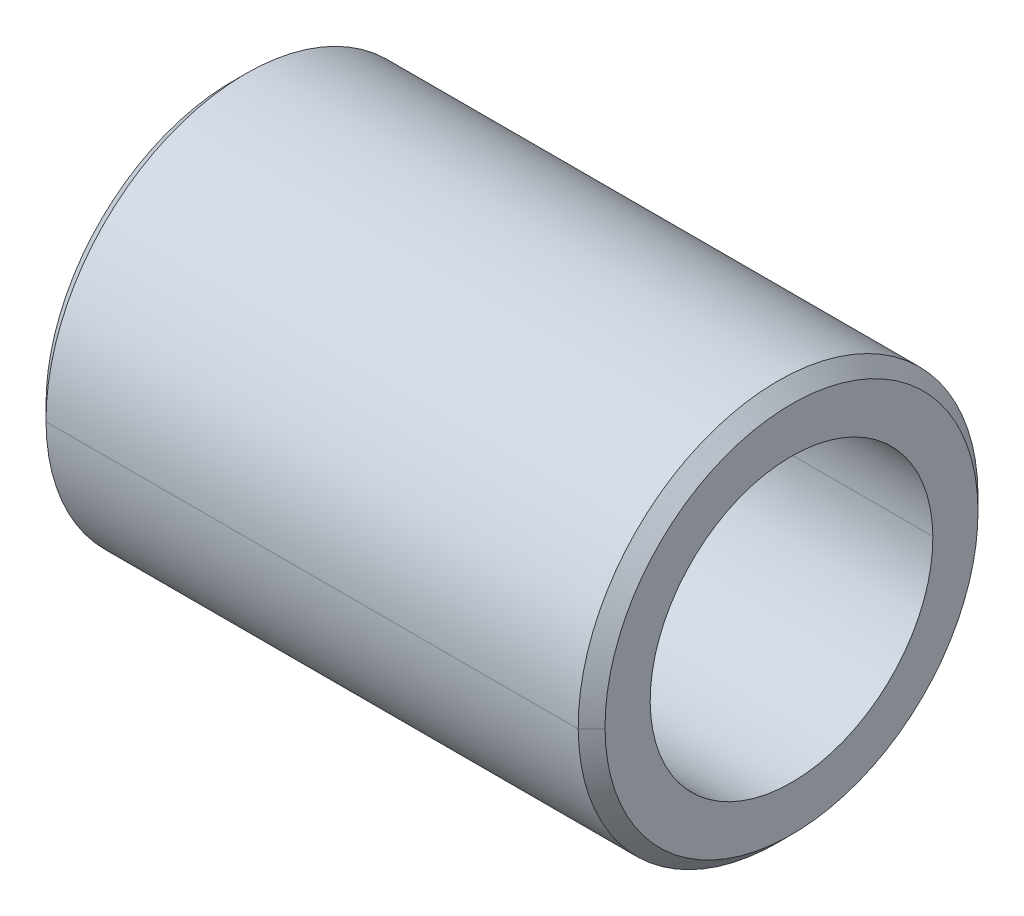
ISO-10303-21;
HEADER;
FILE_DESCRIPTION(('STEP AP214'),'2;1');
FILE_NAME('part.step','',(''),(''),'','','');
FILE_SCHEMA(('AUTOMOTIVE_DESIGN { 1 0 10303 214 1 1 1 1 }'));
ENDSEC;
DATA;
#1=APPLICATION_CONTEXT('core data for automotive mechanical design processes');
#2=APPLICATION_PROTOCOL_DEFINITION('international standard','automotive_design',2000,#1);
#3=PRODUCT_CONTEXT('',#1,'mechanical');
#4=PRODUCT('Part','Part','',(#3));
#5=PRODUCT_RELATED_PRODUCT_CATEGORY('part','',(#4));
#6=PRODUCT_DEFINITION_FORMATION('','',#4);
#7=PRODUCT_DEFINITION_CONTEXT('part definition',#1,'design');
#8=PRODUCT_DEFINITION('design','',#6,#7);
#9=PRODUCT_DEFINITION_SHAPE('','',#8);
#10=(LENGTH_UNIT() NAMED_UNIT(*) SI_UNIT(.MILLI.,.METRE.));
#11=(NAMED_UNIT(*) PLANE_ANGLE_UNIT() SI_UNIT($,.RADIAN.));
#12=(NAMED_UNIT(*) SI_UNIT($,.STERADIAN.) SOLID_ANGLE_UNIT());
#13=UNCERTAINTY_MEASURE_WITH_UNIT(LENGTH_MEASURE(1.E-05),#10,'distance_accuracy_value','');
#14=(GEOMETRIC_REPRESENTATION_CONTEXT(3) GLOBAL_UNCERTAINTY_ASSIGNED_CONTEXT((#13)) GLOBAL_UNIT_ASSIGNED_CONTEXT((#10,
#11,#12)) REPRESENTATION_CONTEXT('',''));
#15=CARTESIAN_POINT('',(0.,0.,0.));
#16=DIRECTION('',(0.,0.,1.));
#17=DIRECTION('',(1.,0.,0.));
#18=AXIS2_PLACEMENT_3D('',#15,#16,#17);
#19=CARTESIAN_POINT('',(7.93749999999999,-0.216245198078711,25.39907947179));
#20=DIRECTION('',(-1.,0.,0.));
#21=DIRECTION('',(0.,-0.00851359047553973,0.999963758731893));
#22=AXIS2_PLACEMENT_3D('',#19,#20,#21);
#23=CYLINDRICAL_SURFACE('',#22,4.0132);
#24=CARTESIAN_POINT('',(7.93749999999999,-0.216245198078711,25.39907947179));
#25=DIRECTION('',(-1.,0.,0.));
#26=DIRECTION('',(0.,-0.0085135904755396,0.999963758731893));
#27=AXIS2_PLACEMENT_3D('',#24,#25,#26);
#28=CIRCLE('',#27,4.0132);
#29=CARTESIAN_POINT('',(7.93749999999999,-0.250411939375147,29.4121340283329));
#30=VERTEX_POINT('',#29);
#31=CARTESIAN_POINT('',(7.93749999999999,-0.182078456782275,21.3860249152472));
#32=VERTEX_POINT('',#31);
#33=EDGE_CURVE('E118',#30,#32,#28,.T.);
#34=ORIENTED_EDGE('',*,*,#33,.F.);
#35=DIRECTION('',(1.,0.,0.));
#36=VECTOR('',#35,1.);
#37=CARTESIAN_POINT('',(-7.93750000000001,-0.250411939375147,29.4121340283329));
#38=LINE('',#37,#36);
#39=CARTESIAN_POINT('',(-7.9375,-0.250411939375146,29.4121340283329));
#40=VERTEX_POINT('',#39);
#41=EDGE_CURVE('E24',#40,#30,#38,.T.);
#42=ORIENTED_EDGE('',*,*,#41,.F.);
#43=CARTESIAN_POINT('',(-7.93749999999999,-0.21624519807871,25.39907947179));
#44=DIRECTION('',(1.,0.,0.));
#45=DIRECTION('',(0.,0.0085135904755396,-0.999963758731893));
#46=AXIS2_PLACEMENT_3D('',#43,#44,#45);
#47=CIRCLE('',#46,4.0132);
#48=CARTESIAN_POINT('',(-7.9375,-0.182078456782274,21.3860249152472));
#49=VERTEX_POINT('',#48);
#50=EDGE_CURVE('E35',#49,#40,#47,.T.);
#51=ORIENTED_EDGE('',*,*,#50,.F.);
#52=DIRECTION('',(-1.,0.,0.));
#53=VECTOR('',#52,1.);
#54=CARTESIAN_POINT('',(7.93749999999999,-0.182078456782275,21.3860249152472));
#55=LINE('',#54,#53);
#56=EDGE_CURVE('E11',#32,#49,#55,.T.);
#57=ORIENTED_EDGE('',*,*,#56,.F.);
#58=EDGE_LOOP('',(#34,#42,#51,#57));
#59=FACE_BOUND('',#58,.T.);
#60=ADVANCED_FACE('F17',(#59),#23,.F.);
#61=CARTESIAN_POINT('',(7.93749999999999,-0.216245198078711,25.39907947179));
#62=DIRECTION('',(-1.,0.,0.));
#63=DIRECTION('',(0.,-0.00851359047553973,0.999963758731893));
#64=AXIS2_PLACEMENT_3D('',#61,#62,#63);
#65=CYLINDRICAL_SURFACE('',#64,4.0132);
#66=ORIENTED_EDGE('',*,*,#56,.T.);
#67=CARTESIAN_POINT('',(-7.93749999999999,-0.21624519807871,25.39907947179));
#68=DIRECTION('',(1.,0.,0.));
#69=DIRECTION('',(0.,-0.0085135904755396,0.999963758731893));
#70=AXIS2_PLACEMENT_3D('',#67,#68,#69);
#71=CIRCLE('',#70,4.0132);
#72=EDGE_CURVE('E83',#40,#49,#71,.T.);
#73=ORIENTED_EDGE('',*,*,#72,.F.);
#74=ORIENTED_EDGE('',*,*,#41,.T.);
#75=CARTESIAN_POINT('',(7.93749999999999,-0.216245198078711,25.39907947179));
#76=DIRECTION('',(-1.,0.,0.));
#77=DIRECTION('',(0.,0.0085135904755396,-0.999963758731893));
#78=AXIS2_PLACEMENT_3D('',#75,#76,#77);
#79=CIRCLE('',#78,4.0132);
#80=EDGE_CURVE('E113',#32,#30,#79,.T.);
#81=ORIENTED_EDGE('',*,*,#80,.F.);
#82=EDGE_LOOP('',(#66,#73,#74,#81));
#83=FACE_BOUND('',#82,.T.);
#84=ADVANCED_FACE('F123',(#83),#65,.F.);
#85=CARTESIAN_POINT('',(7.94512,-0.216245198078711,25.39907947179));
#86=DIRECTION('',(-1.,0.,0.));
#87=DIRECTION('',(0.,-0.00851359047553973,0.999963758731893));
#88=AXIS2_PLACEMENT_3D('',#85,#86,#87);
#89=CONICAL_SURFACE('',#88,5.28828,0.785398163397445);
#90=CARTESIAN_POINT('',(7.93749999999999,-0.216245198078711,25.39907947179));
#91=DIRECTION('',(1.,0.,0.));
#92=DIRECTION('',(0.,-0.0085135904755396,0.999963758731893));
#93=AXIS2_PLACEMENT_3D('',#90,#91,#92);
#94=CIRCLE('',#93,5.2959);
#95=CARTESIAN_POINT('',(7.93749999999999,-0.261332321878122,30.6947875416583));
#96=VERTEX_POINT('',#95);
#97=CARTESIAN_POINT('',(7.9375,-0.1711580742793,20.1033714019218));
#98=VERTEX_POINT('',#97);
#99=EDGE_CURVE('E110',#96,#98,#94,.T.);
#100=ORIENTED_EDGE('',*,*,#99,.F.);
#101=DIRECTION('',(0.70710678118655,0.00602001755749936,-0.707081154740108));
#102=VECTOR('',#101,1.);
#103=CARTESIAN_POINT('',(7.55649999999999,-0.264575999849303,31.0757737337351));
#104=LINE('',#103,#102);
#105=CARTESIAN_POINT('',(7.55649999999999,-0.264575999849303,31.0757737337351));
#106=VERTEX_POINT('',#105);
#107=EDGE_CURVE('E100',#106,#96,#104,.T.);
#108=ORIENTED_EDGE('',*,*,#107,.F.);
#109=CARTESIAN_POINT('',(7.55649999999999,-0.216245198078711,25.39907947179));
#110=DIRECTION('',(1.,0.,0.));
#111=DIRECTION('',(0.,-0.00851359047553998,0.999963758731893));
#112=AXIS2_PLACEMENT_3D('',#109,#110,#111);
#113=CIRCLE('',#112,5.6769);
#114=CARTESIAN_POINT('',(7.55649999999999,-0.167914396308119,19.722385209845));
#115=VERTEX_POINT('',#114);
#116=EDGE_CURVE('E98',#106,#115,#113,.T.);
#117=ORIENTED_EDGE('',*,*,#116,.T.);
#118=DIRECTION('',(-0.70710678118655,0.00602001755749946,-0.707081154740108));
#119=VECTOR('',#118,1.);
#120=CARTESIAN_POINT('',(7.9375,-0.1711580742793,20.1033714019218));
#121=LINE('',#120,#119);
#122=EDGE_CURVE('E103',#98,#115,#121,.T.);
#123=ORIENTED_EDGE('',*,*,#122,.F.);
#124=EDGE_LOOP('',(#100,#108,#117,#123));
#125=FACE_BOUND('',#124,.T.);
#126=ADVANCED_FACE('F142',(#125),#89,.T.);
#127=CARTESIAN_POINT('',(7.93749999999999,-0.216245198078711,25.39907947179));
#128=DIRECTION('',(1.,0.,0.));
#129=DIRECTION('',(0.,0.00851359047553973,-0.999963758731893));
#130=AXIS2_PLACEMENT_3D('',#127,#128,#129);
#131=PLANE('',#130);
#132=ORIENTED_EDGE('',*,*,#33,.T.);
#133=ORIENTED_EDGE('',*,*,#80,.T.);
#134=EDGE_LOOP('',(#132,#133));
#135=FACE_BOUND('',#134,.T.);
#136=CARTESIAN_POINT('',(7.93749999999999,-0.216245198078711,25.39907947179));
#137=DIRECTION('',(1.,0.,0.));
#138=DIRECTION('',(0.,0.0085135904755396,-0.999963758731893));
#139=AXIS2_PLACEMENT_3D('',#136,#137,#138);
#140=CIRCLE('',#139,5.2959);
#141=EDGE_CURVE('E104',#98,#96,#140,.T.);
#142=ORIENTED_EDGE('',*,*,#141,.T.);
#143=ORIENTED_EDGE('',*,*,#99,.T.);
#144=EDGE_LOOP('',(#142,#143));
#145=FACE_BOUND('',#144,.T.);
#146=ADVANCED_FACE('F125',(#135,#145),#131,.T.);
#147=CARTESIAN_POINT('',(7.94512,-0.216245198078711,25.39907947179));
#148=DIRECTION('',(-1.,0.,0.));
#149=DIRECTION('',(0.,-0.00851359047553973,0.999963758731893));
#150=AXIS2_PLACEMENT_3D('',#147,#148,#149);
#151=CONICAL_SURFACE('',#150,5.28828,0.785398163397445);
#152=ORIENTED_EDGE('',*,*,#122,.T.);
#153=CARTESIAN_POINT('',(7.55649999999999,-0.216245198078711,25.39907947179));
#154=DIRECTION('',(1.,0.,0.));
#155=DIRECTION('',(0.,0.00851359047553985,-0.999963758731893));
#156=AXIS2_PLACEMENT_3D('',#153,#154,#155);
#157=CIRCLE('',#156,5.6769);
#158=EDGE_CURVE('E105',#115,#106,#157,.T.);
#159=ORIENTED_EDGE('',*,*,#158,.T.);
#160=ORIENTED_EDGE('',*,*,#107,.T.);
#161=ORIENTED_EDGE('',*,*,#141,.F.);
#162=EDGE_LOOP('',(#152,#159,#160,#161));
#163=FACE_BOUND('',#162,.T.);
#164=ADVANCED_FACE('F151',(#163),#151,.T.);
#165=CARTESIAN_POINT('',(7.93749999999999,-0.216245198078711,25.39907947179));
#166=DIRECTION('',(-1.,0.,0.));
#167=DIRECTION('',(0.,-0.00851359047553973,0.999963758731893));
#168=AXIS2_PLACEMENT_3D('',#165,#166,#167);
#169=CYLINDRICAL_SURFACE('',#168,5.6769);
#170=DIRECTION('',(-1.,0.,0.));
#171=VECTOR('',#170,1.);
#172=CARTESIAN_POINT('',(7.55649999999999,-0.167914396308119,19.722385209845));
#173=LINE('',#172,#171);
#174=CARTESIAN_POINT('',(-7.55650000000002,-0.167914396308119,19.722385209845));
#175=VERTEX_POINT('',#174);
#176=EDGE_CURVE('E94',#115,#175,#173,.T.);
#177=ORIENTED_EDGE('',*,*,#176,.T.);
#178=CARTESIAN_POINT('',(-7.55650000000001,-0.21624519807871,25.39907947179));
#179=DIRECTION('',(-1.,0.,0.));
#180=DIRECTION('',(0.,-0.00851359047553973,0.999963758731893));
#181=AXIS2_PLACEMENT_3D('',#178,#179,#180);
#182=CIRCLE('',#181,5.6769);
#183=CARTESIAN_POINT('',(-7.55650000000002,-0.264575999849302,31.0757737337351));
#184=VERTEX_POINT('',#183);
#185=EDGE_CURVE('E77',#184,#175,#182,.T.);
#186=ORIENTED_EDGE('',*,*,#185,.F.);
#187=DIRECTION('',(1.,0.,0.));
#188=VECTOR('',#187,1.);
#189=CARTESIAN_POINT('',(-7.55650000000003,-0.264575999849302,31.0757737337351));
#190=LINE('',#189,#188);
#191=EDGE_CURVE('E95',#184,#106,#190,.T.);
#192=ORIENTED_EDGE('',*,*,#191,.T.);
#193=ORIENTED_EDGE('',*,*,#158,.F.);
#194=EDGE_LOOP('',(#177,#186,#192,#193));
#195=FACE_BOUND('',#194,.T.);
#196=ADVANCED_FACE('F154',(#195),#169,.T.);
#197=CARTESIAN_POINT('',(7.93749999999999,-0.216245198078711,25.39907947179));
#198=DIRECTION('',(-1.,0.,0.));
#199=DIRECTION('',(0.,-0.00851359047553973,0.999963758731893));
#200=AXIS2_PLACEMENT_3D('',#197,#198,#199);
#201=CYLINDRICAL_SURFACE('',#200,5.6769);
#202=ORIENTED_EDGE('',*,*,#116,.F.);
#203=ORIENTED_EDGE('',*,*,#191,.F.);
#204=CARTESIAN_POINT('',(-7.55650000000001,-0.21624519807871,25.39907947179));
#205=DIRECTION('',(-1.,0.,0.));
#206=DIRECTION('',(0.,0.00851359047553986,-0.999963758731893));
#207=AXIS2_PLACEMENT_3D('',#204,#205,#206);
#208=CIRCLE('',#207,5.67689999999999);
#209=EDGE_CURVE('E73',#175,#184,#208,.T.);
#210=ORIENTED_EDGE('',*,*,#209,.F.);
#211=ORIENTED_EDGE('',*,*,#176,.F.);
#212=EDGE_LOOP('',(#202,#203,#210,#211));
#213=FACE_BOUND('',#212,.T.);
#214=ADVANCED_FACE('F136',(#213),#201,.T.);
#215=CARTESIAN_POINT('',(-7.94512000000001,-0.21624519807871,25.39907947179));
#216=DIRECTION('',(1.,0.,0.));
#217=DIRECTION('',(0.,0.00851359047553973,-0.999963758731893));
#218=AXIS2_PLACEMENT_3D('',#215,#216,#217);
#219=CONICAL_SURFACE('',#218,5.28828,0.785398163397452);
#220=CARTESIAN_POINT('',(-7.9375,-0.21624519807871,25.39907947179));
#221=DIRECTION('',(-1.,0.,0.));
#222=DIRECTION('',(0.,0.00851359047553985,-0.999963758731893));
#223=AXIS2_PLACEMENT_3D('',#220,#221,#222);
#224=CIRCLE('',#223,5.2959);
#225=CARTESIAN_POINT('',(-7.9375,-0.171158074279299,20.1033714019218));
#226=VERTEX_POINT('',#225);
#227=CARTESIAN_POINT('',(-7.93750000000001,-0.261332321878121,30.6947875416583));
#228=VERTEX_POINT('',#227);
#229=EDGE_CURVE('E70',#226,#228,#224,.T.);
#230=ORIENTED_EDGE('',*,*,#229,.F.);
#231=DIRECTION('',(-0.707106781186544,-0.00602001755749932,0.707081154740113));
#232=VECTOR('',#231,1.);
#233=CARTESIAN_POINT('',(-7.55650000000001,-0.167914396308119,19.722385209845));
#234=LINE('',#233,#232);
#235=EDGE_CURVE('E86',#175,#226,#234,.T.);
#236=ORIENTED_EDGE('',*,*,#235,.F.);
#237=ORIENTED_EDGE('',*,*,#209,.T.);
#238=DIRECTION('',(0.707106781186544,-0.00602001755749927,0.707081154740113));
#239=VECTOR('',#238,1.);
#240=CARTESIAN_POINT('',(-7.93750000000001,-0.26133232187812,30.6947875416583));
#241=LINE('',#240,#239);
#242=EDGE_CURVE('E66',#228,#184,#241,.T.);
#243=ORIENTED_EDGE('',*,*,#242,.F.);
#244=EDGE_LOOP('',(#230,#236,#237,#243));
#245=FACE_BOUND('',#244,.T.);
#246=ADVANCED_FACE('F68',(#245),#219,.T.);
#247=CARTESIAN_POINT('',(-7.9375,-0.21624519807871,25.39907947179));
#248=DIRECTION('',(1.,0.,0.));
#249=DIRECTION('',(0.,0.00851359047553973,-0.999963758731893));
#250=AXIS2_PLACEMENT_3D('',#247,#248,#249);
#251=PLANE('',#250);
#252=ORIENTED_EDGE('',*,*,#50,.T.);
#253=ORIENTED_EDGE('',*,*,#72,.T.);
#254=EDGE_LOOP('',(#252,#253));
#255=FACE_BOUND('',#254,.T.);
#256=CARTESIAN_POINT('',(-7.9375,-0.21624519807871,25.39907947179));
#257=DIRECTION('',(-1.,0.,0.));
#258=DIRECTION('',(0.,-0.00851359047553984,0.999963758731893));
#259=AXIS2_PLACEMENT_3D('',#256,#257,#258);
#260=CIRCLE('',#259,5.2959);
#261=EDGE_CURVE('E81',#228,#226,#260,.T.);
#262=ORIENTED_EDGE('',*,*,#261,.T.);
#263=ORIENTED_EDGE('',*,*,#229,.T.);
#264=EDGE_LOOP('',(#262,#263));
#265=FACE_BOUND('',#264,.T.);
#266=ADVANCED_FACE('F80',(#255,#265),#251,.F.);
#267=CARTESIAN_POINT('',(-7.94512000000001,-0.21624519807871,25.39907947179));
#268=DIRECTION('',(1.,0.,0.));
#269=DIRECTION('',(0.,0.00851359047553973,-0.999963758731893));
#270=AXIS2_PLACEMENT_3D('',#267,#268,#269);
#271=CONICAL_SURFACE('',#270,5.28828,0.785398163397452);
#272=ORIENTED_EDGE('',*,*,#242,.T.);
#273=ORIENTED_EDGE('',*,*,#185,.T.);
#274=ORIENTED_EDGE('',*,*,#235,.T.);
#275=ORIENTED_EDGE('',*,*,#261,.F.);
#276=EDGE_LOOP('',(#272,#273,#274,#275));
#277=FACE_BOUND('',#276,.T.);
#278=ADVANCED_FACE('F85',(#277),#271,.T.);
#279=CLOSED_SHELL('',(#60,#84,#126,#146,#164,#196,#214,#246,#266,#278));
#280=MANIFOLD_SOLID_BREP('B1',#279);
#281=ADVANCED_BREP_SHAPE_REPRESENTATION('',(#18,#280),#14);
#282=SHAPE_DEFINITION_REPRESENTATION(#9,#281);
ENDSEC;
END-ISO-10303-21;
